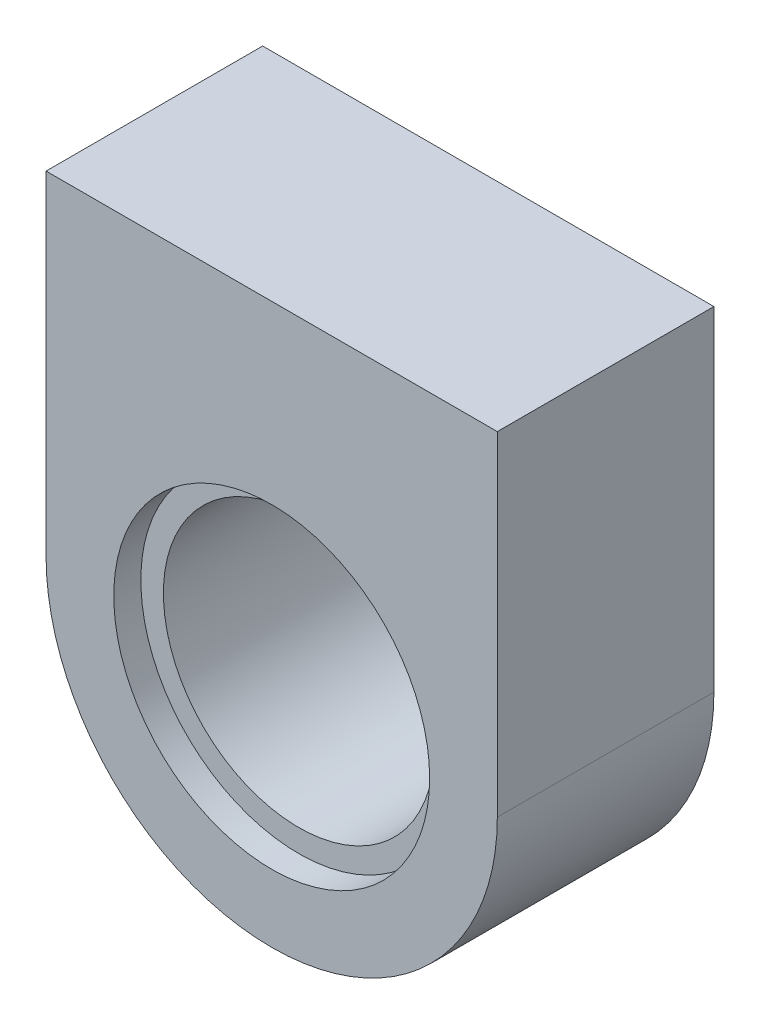
ISO-10303-21;
HEADER;
FILE_DESCRIPTION(('STEP AP214'),'2;1');
FILE_NAME('part.step','',(''),(''),'','','');
FILE_SCHEMA(('AUTOMOTIVE_DESIGN { 1 0 10303 214 1 1 1 1 }'));
ENDSEC;
DATA;
#1=APPLICATION_CONTEXT('core data for automotive mechanical design processes');
#2=APPLICATION_PROTOCOL_DEFINITION('international standard','automotive_design',2000,#1);
#3=PRODUCT_CONTEXT('',#1,'mechanical');
#4=PRODUCT('Part','Part','',(#3));
#5=PRODUCT_RELATED_PRODUCT_CATEGORY('part','',(#4));
#6=PRODUCT_DEFINITION_FORMATION('','',#4);
#7=PRODUCT_DEFINITION_CONTEXT('part definition',#1,'design');
#8=PRODUCT_DEFINITION('design','',#6,#7);
#9=PRODUCT_DEFINITION_SHAPE('','',#8);
#10=(LENGTH_UNIT() NAMED_UNIT(*) SI_UNIT(.MILLI.,.METRE.));
#11=(NAMED_UNIT(*) PLANE_ANGLE_UNIT() SI_UNIT($,.RADIAN.));
#12=(NAMED_UNIT(*) SI_UNIT($,.STERADIAN.) SOLID_ANGLE_UNIT());
#13=UNCERTAINTY_MEASURE_WITH_UNIT(LENGTH_MEASURE(1.E-05),#10,'distance_accuracy_value','');
#14=(GEOMETRIC_REPRESENTATION_CONTEXT(3) GLOBAL_UNCERTAINTY_ASSIGNED_CONTEXT((#13)) GLOBAL_UNIT_ASSIGNED_CONTEXT((#10,
#11,#12)) REPRESENTATION_CONTEXT('',''));
#15=CARTESIAN_POINT('',(0.,0.,0.));
#16=DIRECTION('',(0.,0.,1.));
#17=DIRECTION('',(1.,0.,0.));
#18=AXIS2_PLACEMENT_3D('',#15,#16,#17);
#19=CARTESIAN_POINT('',(0.,0.,24.));
#20=DIRECTION('',(0.,0.,-1.));
#21=DIRECTION('',(-1.,0.,0.));
#22=AXIS2_PLACEMENT_3D('',#19,#20,#21);
#23=CYLINDRICAL_SURFACE('',#22,25.);
#24=CARTESIAN_POINT('',(0.,0.,0.));
#25=DIRECTION('',(0.,0.,1.));
#26=DIRECTION('',(1.,0.,0.));
#27=AXIS2_PLACEMENT_3D('',#24,#25,#26);
#28=CIRCLE('',#27,25.);
#29=CARTESIAN_POINT('',(-25.,0.,0.));
#30=VERTEX_POINT('',#29);
#31=CARTESIAN_POINT('',(25.,0.,0.));
#32=VERTEX_POINT('',#31);
#33=EDGE_CURVE('E98',#30,#32,#28,.T.);
#34=ORIENTED_EDGE('',*,*,#33,.T.);
#35=DIRECTION('',(0.,0.,-1.));
#36=VECTOR('',#35,1.);
#37=CARTESIAN_POINT('',(25.,0.,24.));
#38=LINE('',#37,#36);
#39=CARTESIAN_POINT('',(25.,0.,24.));
#40=VERTEX_POINT('',#39);
#41=EDGE_CURVE('E11',#40,#32,#38,.T.);
#42=ORIENTED_EDGE('',*,*,#41,.F.);
#43=CARTESIAN_POINT('',(0.,0.,24.));
#44=DIRECTION('',(0.,0.,1.));
#45=DIRECTION('',(1.,0.,0.));
#46=AXIS2_PLACEMENT_3D('',#43,#44,#45);
#47=CIRCLE('',#46,25.);
#48=CARTESIAN_POINT('',(-25.,0.,24.));
#49=VERTEX_POINT('',#48);
#50=EDGE_CURVE('E86',#49,#40,#47,.T.);
#51=ORIENTED_EDGE('',*,*,#50,.F.);
#52=DIRECTION('',(0.,0.,-1.));
#53=VECTOR('',#52,1.);
#54=CARTESIAN_POINT('',(-25.,0.,24.));
#55=LINE('',#54,#53);
#56=EDGE_CURVE('E94',#49,#30,#55,.T.);
#57=ORIENTED_EDGE('',*,*,#56,.T.);
#58=EDGE_LOOP('',(#34,#42,#51,#57));
#59=FACE_BOUND('',#58,.T.);
#60=ADVANCED_FACE('F35',(#59),#23,.T.);
#61=CARTESIAN_POINT('',(25.,37.,24.));
#62=DIRECTION('',(-1.,0.,0.));
#63=DIRECTION('',(0.,0.,1.));
#64=AXIS2_PLACEMENT_3D('',#61,#62,#63);
#65=PLANE('',#64);
#66=DIRECTION('',(0.,1.,0.));
#67=VECTOR('',#66,1.);
#68=CARTESIAN_POINT('',(25.,37.,0.));
#69=LINE('',#68,#67);
#70=CARTESIAN_POINT('',(25.,37.,0.));
#71=VERTEX_POINT('',#70);
#72=EDGE_CURVE('E90',#32,#71,#69,.T.);
#73=ORIENTED_EDGE('',*,*,#72,.T.);
#74=DIRECTION('',(0.,0.,-1.));
#75=VECTOR('',#74,1.);
#76=CARTESIAN_POINT('',(25.,37.,24.));
#77=LINE('',#76,#75);
#78=CARTESIAN_POINT('',(25.,37.,24.));
#79=VERTEX_POINT('',#78);
#80=EDGE_CURVE('E43',#79,#71,#77,.T.);
#81=ORIENTED_EDGE('',*,*,#80,.F.);
#82=DIRECTION('',(0.,1.,0.));
#83=VECTOR('',#82,1.);
#84=CARTESIAN_POINT('',(25.,37.,24.));
#85=LINE('',#84,#83);
#86=EDGE_CURVE('E81',#40,#79,#85,.T.);
#87=ORIENTED_EDGE('',*,*,#86,.F.);
#88=ORIENTED_EDGE('',*,*,#41,.T.);
#89=EDGE_LOOP('',(#73,#81,#87,#88));
#90=FACE_BOUND('',#89,.T.);
#91=ADVANCED_FACE('F89',(#90),#65,.F.);
#92=CARTESIAN_POINT('',(-25.,37.,24.));
#93=DIRECTION('',(0.,-1.,0.));
#94=DIRECTION('',(0.,0.,-1.));
#95=AXIS2_PLACEMENT_3D('',#92,#93,#94);
#96=PLANE('',#95);
#97=DIRECTION('',(-1.,0.,0.));
#98=VECTOR('',#97,1.);
#99=CARTESIAN_POINT('',(-25.,37.,0.));
#100=LINE('',#99,#98);
#101=CARTESIAN_POINT('',(-25.,37.,0.));
#102=VERTEX_POINT('',#101);
#103=EDGE_CURVE('E68',#71,#102,#100,.T.);
#104=ORIENTED_EDGE('',*,*,#103,.T.);
#105=DIRECTION('',(0.,0.,-1.));
#106=VECTOR('',#105,1.);
#107=CARTESIAN_POINT('',(-25.,37.,24.));
#108=LINE('',#107,#106);
#109=CARTESIAN_POINT('',(-25.,37.,24.));
#110=VERTEX_POINT('',#109);
#111=EDGE_CURVE('E91',#110,#102,#108,.T.);
#112=ORIENTED_EDGE('',*,*,#111,.F.);
#113=DIRECTION('',(-1.,0.,0.));
#114=VECTOR('',#113,1.);
#115=CARTESIAN_POINT('',(-25.,37.,24.));
#116=LINE('',#115,#114);
#117=EDGE_CURVE('E84',#79,#110,#116,.T.);
#118=ORIENTED_EDGE('',*,*,#117,.F.);
#119=ORIENTED_EDGE('',*,*,#80,.T.);
#120=EDGE_LOOP('',(#104,#112,#118,#119));
#121=FACE_BOUND('',#120,.T.);
#122=ADVANCED_FACE('F92',(#121),#96,.F.);
#123=CARTESIAN_POINT('',(-25.,0.,24.));
#124=DIRECTION('',(1.,0.,0.));
#125=DIRECTION('',(0.,0.,-1.));
#126=AXIS2_PLACEMENT_3D('',#123,#124,#125);
#127=PLANE('',#126);
#128=DIRECTION('',(0.,-1.,0.));
#129=VECTOR('',#128,1.);
#130=CARTESIAN_POINT('',(-25.,0.,0.));
#131=LINE('',#130,#129);
#132=EDGE_CURVE('E74',#102,#30,#131,.T.);
#133=ORIENTED_EDGE('',*,*,#132,.T.);
#134=ORIENTED_EDGE('',*,*,#56,.F.);
#135=DIRECTION('',(0.,-1.,0.));
#136=VECTOR('',#135,1.);
#137=CARTESIAN_POINT('',(-25.,0.,24.));
#138=LINE('',#137,#136);
#139=EDGE_CURVE('E51',#110,#49,#138,.T.);
#140=ORIENTED_EDGE('',*,*,#139,.F.);
#141=ORIENTED_EDGE('',*,*,#111,.T.);
#142=EDGE_LOOP('',(#133,#134,#140,#141));
#143=FACE_BOUND('',#142,.T.);
#144=ADVANCED_FACE('F106',(#143),#127,.F.);
#145=CARTESIAN_POINT('',(0.,0.,24.));
#146=DIRECTION('',(0.,0.,1.));
#147=DIRECTION('',(1.,0.,0.));
#148=AXIS2_PLACEMENT_3D('',#145,#146,#147);
#149=PLANE('',#148);
#150=CARTESIAN_POINT('',(0.,0.,24.));
#151=DIRECTION('',(0.,0.,1.));
#152=DIRECTION('',(1.,0.,0.));
#153=AXIS2_PLACEMENT_3D('',#150,#151,#152);
#154=CIRCLE('',#153,17.5);
#155=CARTESIAN_POINT('',(17.5,0.,24.));
#156=VERTEX_POINT('',#155);
#157=EDGE_CURVE('E112',#156,#156,#154,.T.);
#158=ORIENTED_EDGE('',*,*,#157,.F.);
#159=EDGE_LOOP('',(#158));
#160=FACE_BOUND('',#159,.T.);
#161=ORIENTED_EDGE('',*,*,#50,.T.);
#162=ORIENTED_EDGE('',*,*,#86,.T.);
#163=ORIENTED_EDGE('',*,*,#117,.T.);
#164=ORIENTED_EDGE('',*,*,#139,.T.);
#165=EDGE_LOOP('',(#161,#162,#163,#164));
#166=FACE_BOUND('',#165,.T.);
#167=ADVANCED_FACE('F82',(#160,#166),#149,.T.);
#168=CARTESIAN_POINT('',(0.,0.,0.));
#169=DIRECTION('',(0.,0.,1.));
#170=DIRECTION('',(1.,0.,0.));
#171=AXIS2_PLACEMENT_3D('',#168,#169,#170);
#172=PLANE('',#171);
#173=CARTESIAN_POINT('',(0.,0.,0.));
#174=DIRECTION('',(0.,0.,1.));
#175=DIRECTION('',(1.,0.,0.));
#176=AXIS2_PLACEMENT_3D('',#173,#174,#175);
#177=CIRCLE('',#176,15.);
#178=CARTESIAN_POINT('',(15.,0.,0.));
#179=VERTEX_POINT('',#178);
#180=EDGE_CURVE('E115',#179,#179,#177,.F.);
#181=ORIENTED_EDGE('',*,*,#180,.F.);
#182=EDGE_LOOP('',(#181));
#183=FACE_BOUND('',#182,.T.);
#184=ORIENTED_EDGE('',*,*,#33,.F.);
#185=ORIENTED_EDGE('',*,*,#132,.F.);
#186=ORIENTED_EDGE('',*,*,#103,.F.);
#187=ORIENTED_EDGE('',*,*,#72,.F.);
#188=EDGE_LOOP('',(#184,#185,#186,#187));
#189=FACE_BOUND('',#188,.T.);
#190=ADVANCED_FACE('F109',(#183,#189),#172,.F.);
#191=CARTESIAN_POINT('',(0.,0.,21.));
#192=DIRECTION('',(0.,0.,1.));
#193=DIRECTION('',(1.,0.,0.));
#194=AXIS2_PLACEMENT_3D('',#191,#192,#193);
#195=CYLINDRICAL_SURFACE('',#194,17.5);
#196=CARTESIAN_POINT('',(0.,0.,21.));
#197=DIRECTION('',(0.,0.,1.));
#198=DIRECTION('',(1.,0.,0.));
#199=AXIS2_PLACEMENT_3D('',#196,#197,#198);
#200=CIRCLE('',#199,17.5);
#201=CARTESIAN_POINT('',(17.5,0.,21.));
#202=VERTEX_POINT('',#201);
#203=EDGE_CURVE('E101',#202,#202,#200,.T.);
#204=ORIENTED_EDGE('',*,*,#203,.F.);
#205=EDGE_LOOP('',(#204));
#206=FACE_BOUND('',#205,.T.);
#207=ORIENTED_EDGE('',*,*,#157,.T.);
#208=EDGE_LOOP('',(#207));
#209=FACE_BOUND('',#208,.T.);
#210=ADVANCED_FACE('F130',(#206,#209),#195,.F.);
#211=CARTESIAN_POINT('',(0.,0.,21.));
#212=DIRECTION('',(0.,0.,1.));
#213=DIRECTION('',(1.,0.,0.));
#214=AXIS2_PLACEMENT_3D('',#211,#212,#213);
#215=PLANE('',#214);
#216=CARTESIAN_POINT('',(0.,0.,21.));
#217=DIRECTION('',(0.,0.,1.));
#218=DIRECTION('',(1.,0.,0.));
#219=AXIS2_PLACEMENT_3D('',#216,#217,#218);
#220=CIRCLE('',#219,15.);
#221=CARTESIAN_POINT('',(15.,0.,21.));
#222=VERTEX_POINT('',#221);
#223=EDGE_CURVE('E120',#222,#222,#220,.T.);
#224=ORIENTED_EDGE('',*,*,#223,.F.);
#225=EDGE_LOOP('',(#224));
#226=FACE_BOUND('',#225,.T.);
#227=ORIENTED_EDGE('',*,*,#203,.T.);
#228=EDGE_LOOP('',(#227));
#229=FACE_BOUND('',#228,.T.);
#230=ADVANCED_FACE('F127',(#226,#229),#215,.T.);
#231=CARTESIAN_POINT('',(0.,0.,-0.001000000000001));
#232=DIRECTION('',(0.,0.,1.));
#233=DIRECTION('',(1.,0.,0.));
#234=AXIS2_PLACEMENT_3D('',#231,#232,#233);
#235=CYLINDRICAL_SURFACE('',#234,15.);
#236=ORIENTED_EDGE('',*,*,#223,.T.);
#237=EDGE_LOOP('',(#236));
#238=FACE_BOUND('',#237,.T.);
#239=ORIENTED_EDGE('',*,*,#180,.T.);
#240=EDGE_LOOP('',(#239));
#241=FACE_BOUND('',#240,.T.);
#242=ADVANCED_FACE('F124',(#238,#241),#235,.F.);
#243=CLOSED_SHELL('',(#60,#91,#122,#144,#167,#190,#210,#230,#242));
#244=MANIFOLD_SOLID_BREP('B2',#243);
#245=ADVANCED_BREP_SHAPE_REPRESENTATION('',(#18,#244),#14);
#246=SHAPE_DEFINITION_REPRESENTATION(#9,#245);
ENDSEC;
END-ISO-10303-21;
